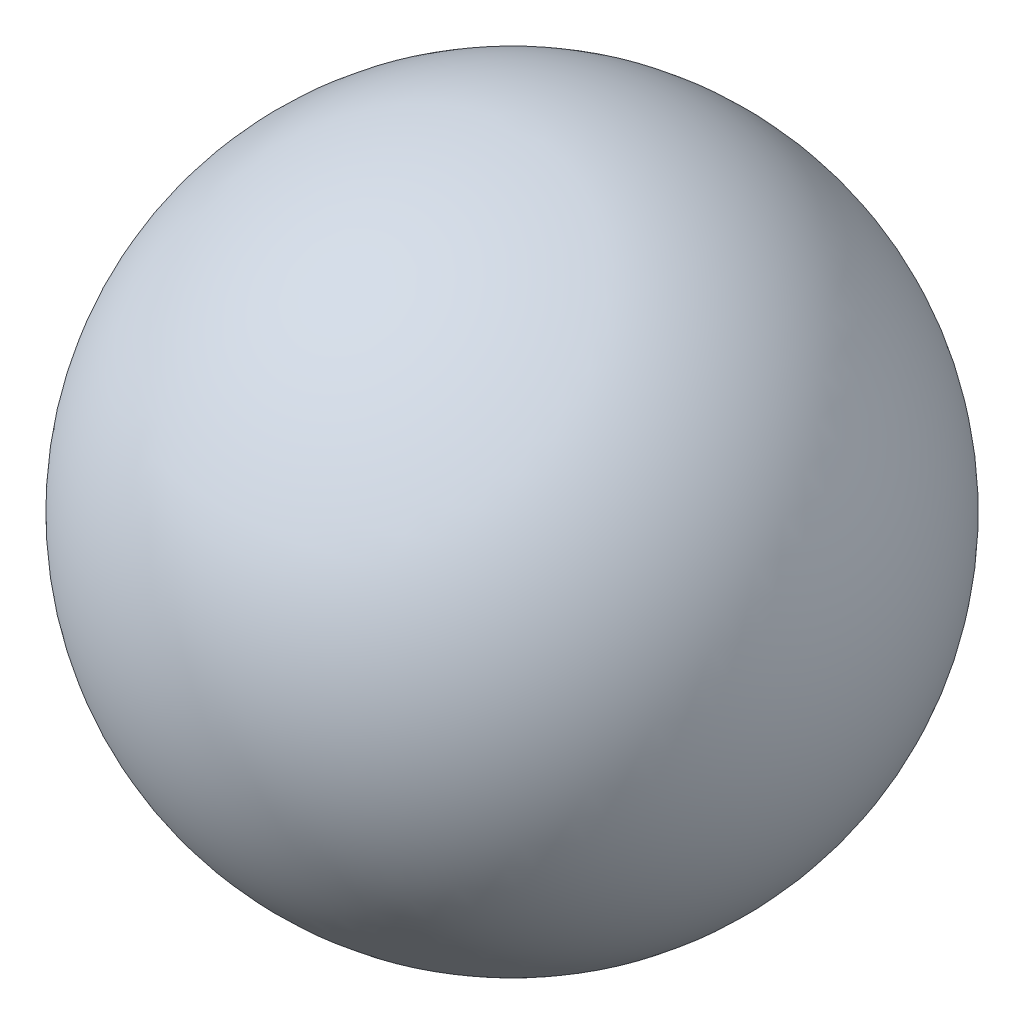
ISO-10303-21;
HEADER;
FILE_DESCRIPTION(('STEP AP214'),'2;1');
FILE_NAME('part.step','',(''),(''),'','','');
FILE_SCHEMA(('AUTOMOTIVE_DESIGN { 1 0 10303 214 1 1 1 1 }'));
ENDSEC;
DATA;
#1=APPLICATION_CONTEXT('core data for automotive mechanical design processes');
#2=APPLICATION_PROTOCOL_DEFINITION('international standard','automotive_design',2000,#1);
#3=PRODUCT_CONTEXT('',#1,'mechanical');
#4=PRODUCT('Part','Part','',(#3));
#5=PRODUCT_RELATED_PRODUCT_CATEGORY('part','',(#4));
#6=PRODUCT_DEFINITION_FORMATION('','',#4);
#7=PRODUCT_DEFINITION_CONTEXT('part definition',#1,'design');
#8=PRODUCT_DEFINITION('design','',#6,#7);
#9=PRODUCT_DEFINITION_SHAPE('','',#8);
#10=(LENGTH_UNIT() NAMED_UNIT(*) SI_UNIT(.MILLI.,.METRE.));
#11=(NAMED_UNIT(*) PLANE_ANGLE_UNIT() SI_UNIT($,.RADIAN.));
#12=(NAMED_UNIT(*) SI_UNIT($,.STERADIAN.) SOLID_ANGLE_UNIT());
#13=UNCERTAINTY_MEASURE_WITH_UNIT(LENGTH_MEASURE(1.E-05),#10,'distance_accuracy_value','');
#14=(GEOMETRIC_REPRESENTATION_CONTEXT(3) GLOBAL_UNCERTAINTY_ASSIGNED_CONTEXT((#13)) GLOBAL_UNIT_ASSIGNED_CONTEXT((#10,
#11,#12)) REPRESENTATION_CONTEXT('',''));
#15=CARTESIAN_POINT('',(0.,0.,0.));
#16=DIRECTION('',(0.,0.,1.));
#17=DIRECTION('',(1.,0.,0.));
#18=AXIS2_PLACEMENT_3D('',#15,#16,#17);
#19=CARTESIAN_POINT('',(0.,0.,0.));
#20=DIRECTION('',(0.,-1.,0.));
#21=DIRECTION('',(0.,0.,1.));
#22=AXIS2_PLACEMENT_3D('',#19,#20,#21);
#23=SPHERICAL_SURFACE('',#22,30.);
#24=CARTESIAN_POINT('',(0.,-30.,0.));
#25=VERTEX_POINT('',#24);
#26=VERTEX_LOOP('',#25);
#27=FACE_BOUND('',#26,.T.);
#28=ADVANCED_FACE('F37',(#27),#23,.T.);
#29=CLOSED_SHELL('',(#28));
#30=MANIFOLD_SOLID_BREP('B2',#29);
#31=ADVANCED_BREP_SHAPE_REPRESENTATION('',(#18,#30),#14);
#32=SHAPE_DEFINITION_REPRESENTATION(#9,#31);
ENDSEC;
END-ISO-10303-21;
